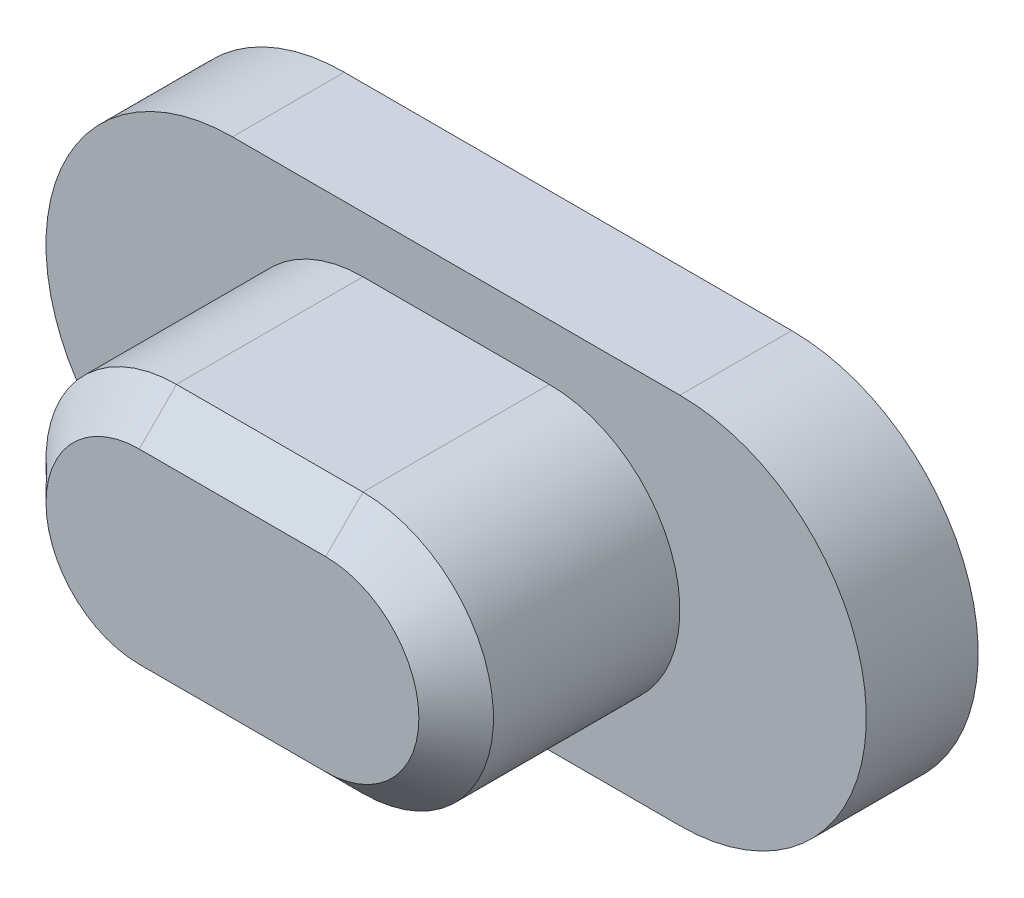
ISO-10303-21;
HEADER;
FILE_DESCRIPTION(('STEP AP214'),'2;1');
FILE_NAME('part.step','',(''),(''),'','','');
FILE_SCHEMA(('AUTOMOTIVE_DESIGN { 1 0 10303 214 1 1 1 1 }'));
ENDSEC;
DATA;
#1=APPLICATION_CONTEXT('core data for automotive mechanical design processes');
#2=APPLICATION_PROTOCOL_DEFINITION('international standard','automotive_design',2000,#1);
#3=PRODUCT_CONTEXT('',#1,'mechanical');
#4=PRODUCT('Part','Part','',(#3));
#5=PRODUCT_RELATED_PRODUCT_CATEGORY('part','',(#4));
#6=PRODUCT_DEFINITION_FORMATION('','',#4);
#7=PRODUCT_DEFINITION_CONTEXT('part definition',#1,'design');
#8=PRODUCT_DEFINITION('design','',#6,#7);
#9=PRODUCT_DEFINITION_SHAPE('','',#8);
#10=(LENGTH_UNIT() NAMED_UNIT(*) SI_UNIT(.MILLI.,.METRE.));
#11=(NAMED_UNIT(*) PLANE_ANGLE_UNIT() SI_UNIT($,.RADIAN.));
#12=(NAMED_UNIT(*) SI_UNIT($,.STERADIAN.) SOLID_ANGLE_UNIT());
#13=UNCERTAINTY_MEASURE_WITH_UNIT(LENGTH_MEASURE(1.E-05),#10,'distance_accuracy_value','');
#14=(GEOMETRIC_REPRESENTATION_CONTEXT(3) GLOBAL_UNCERTAINTY_ASSIGNED_CONTEXT((#13)) GLOBAL_UNIT_ASSIGNED_CONTEXT((#10,
#11,#12)) REPRESENTATION_CONTEXT('',''));
#15=CARTESIAN_POINT('',(0.,0.,0.));
#16=DIRECTION('',(0.,0.,1.));
#17=DIRECTION('',(1.,0.,0.));
#18=AXIS2_PLACEMENT_3D('',#15,#16,#17);
#19=CARTESIAN_POINT('',(-6.,0.,3.));
#20=DIRECTION('',(0.,0.,1.));
#21=DIRECTION('',(1.,0.,0.));
#22=AXIS2_PLACEMENT_3D('',#19,#20,#21);
#23=PLANE('',#22);
#24=CARTESIAN_POINT('',(-6.,0.,3.));
#25=DIRECTION('',(0.,0.,1.));
#26=DIRECTION('',(1.,0.,0.));
#27=AXIS2_PLACEMENT_3D('',#24,#25,#26);
#28=CIRCLE('',#27,5.);
#29=CARTESIAN_POINT('',(-6.,5.,3.));
#30=VERTEX_POINT('',#29);
#31=CARTESIAN_POINT('',(-6.,-5.,3.));
#32=VERTEX_POINT('',#31);
#33=EDGE_CURVE('E199',#30,#32,#28,.T.);
#34=ORIENTED_EDGE('',*,*,#33,.T.);
#35=DIRECTION('',(1.,0.,0.));
#36=VECTOR('',#35,1.);
#37=CARTESIAN_POINT('',(-6.,-5.,3.));
#38=LINE('',#37,#36);
#39=CARTESIAN_POINT('',(6.,-5.,3.));
#40=VERTEX_POINT('',#39);
#41=EDGE_CURVE('E202',#32,#40,#38,.T.);
#42=ORIENTED_EDGE('',*,*,#41,.T.);
#43=CARTESIAN_POINT('',(6.,0.,3.));
#44=DIRECTION('',(0.,0.,1.));
#45=DIRECTION('',(1.,0.,0.));
#46=AXIS2_PLACEMENT_3D('',#43,#44,#45);
#47=CIRCLE('',#46,5.);
#48=CARTESIAN_POINT('',(6.,5.00000000000001,3.));
#49=VERTEX_POINT('',#48);
#50=EDGE_CURVE('E205',#40,#49,#47,.T.);
#51=ORIENTED_EDGE('',*,*,#50,.T.);
#52=DIRECTION('',(-1.,0.,0.));
#53=VECTOR('',#52,1.);
#54=CARTESIAN_POINT('',(-6.,5.,3.));
#55=LINE('',#54,#53);
#56=EDGE_CURVE('E207',#49,#30,#55,.T.);
#57=ORIENTED_EDGE('',*,*,#56,.T.);
#58=EDGE_LOOP('',(#34,#42,#51,#57));
#59=FACE_BOUND('',#58,.T.);
#60=DIRECTION('',(1.,0.,0.));
#61=VECTOR('',#60,1.);
#62=CARTESIAN_POINT('',(-2.5,-3.5,3.));
#63=LINE('',#62,#61);
#64=CARTESIAN_POINT('',(-2.5,-3.5,3.));
#65=VERTEX_POINT('',#64);
#66=CARTESIAN_POINT('',(2.5,-3.5,3.));
#67=VERTEX_POINT('',#66);
#68=EDGE_CURVE('E181',#65,#67,#63,.T.);
#69=ORIENTED_EDGE('',*,*,#68,.F.);
#70=CARTESIAN_POINT('',(-2.5,0.,3.));
#71=DIRECTION('',(0.,0.,1.));
#72=DIRECTION('',(1.,0.,0.));
#73=AXIS2_PLACEMENT_3D('',#70,#71,#72);
#74=CIRCLE('',#73,3.5);
#75=CARTESIAN_POINT('',(-2.5,3.5,3.));
#76=VERTEX_POINT('',#75);
#77=EDGE_CURVE('E175',#76,#65,#74,.T.);
#78=ORIENTED_EDGE('',*,*,#77,.F.);
#79=DIRECTION('',(-1.,0.,0.));
#80=VECTOR('',#79,1.);
#81=CARTESIAN_POINT('',(-2.5,3.5,3.));
#82=LINE('',#81,#80);
#83=CARTESIAN_POINT('',(2.5,3.5,3.));
#84=VERTEX_POINT('',#83);
#85=EDGE_CURVE('E187',#84,#76,#82,.T.);
#86=ORIENTED_EDGE('',*,*,#85,.F.);
#87=CARTESIAN_POINT('',(2.5,0.,3.));
#88=DIRECTION('',(0.,0.,1.));
#89=DIRECTION('',(1.,0.,0.));
#90=AXIS2_PLACEMENT_3D('',#87,#88,#89);
#91=CIRCLE('',#90,3.5);
#92=EDGE_CURVE('E184',#67,#84,#91,.T.);
#93=ORIENTED_EDGE('',*,*,#92,.F.);
#94=EDGE_LOOP('',(#69,#78,#86,#93));
#95=FACE_BOUND('',#94,.T.);
#96=ADVANCED_FACE('F35',(#59,#95),#23,.T.);
#97=CARTESIAN_POINT('',(-6.,0.,3.));
#98=DIRECTION('',(0.,0.,-1.));
#99=DIRECTION('',(-1.,0.,0.));
#100=AXIS2_PLACEMENT_3D('',#97,#98,#99);
#101=CYLINDRICAL_SURFACE('',#100,5.);
#102=CARTESIAN_POINT('',(-6.,0.,0.));
#103=DIRECTION('',(0.,0.,1.));
#104=DIRECTION('',(1.,0.,0.));
#105=AXIS2_PLACEMENT_3D('',#102,#103,#104);
#106=CIRCLE('',#105,5.);
#107=CARTESIAN_POINT('',(-6.,5.,0.));
#108=VERTEX_POINT('',#107);
#109=CARTESIAN_POINT('',(-6.,-5.,0.));
#110=VERTEX_POINT('',#109);
#111=EDGE_CURVE('E198',#108,#110,#106,.T.);
#112=ORIENTED_EDGE('',*,*,#111,.T.);
#113=DIRECTION('',(0.,0.,-1.));
#114=VECTOR('',#113,1.);
#115=CARTESIAN_POINT('',(-6.,-5.,3.));
#116=LINE('',#115,#114);
#117=EDGE_CURVE('E225',#32,#110,#116,.T.);
#118=ORIENTED_EDGE('',*,*,#117,.F.);
#119=ORIENTED_EDGE('',*,*,#33,.F.);
#120=DIRECTION('',(0.,0.,-1.));
#121=VECTOR('',#120,1.);
#122=CARTESIAN_POINT('',(-6.,5.,3.));
#123=LINE('',#122,#121);
#124=EDGE_CURVE('E209',#30,#108,#123,.T.);
#125=ORIENTED_EDGE('',*,*,#124,.T.);
#126=EDGE_LOOP('',(#112,#118,#119,#125));
#127=FACE_BOUND('',#126,.T.);
#128=ADVANCED_FACE('F286',(#127),#101,.T.);
#129=CARTESIAN_POINT('',(-6.,-5.,3.));
#130=DIRECTION('',(0.,1.,0.));
#131=DIRECTION('',(-1.,0.,0.));
#132=AXIS2_PLACEMENT_3D('',#129,#130,#131);
#133=PLANE('',#132);
#134=DIRECTION('',(1.,0.,0.));
#135=VECTOR('',#134,1.);
#136=CARTESIAN_POINT('',(-6.,-5.,0.));
#137=LINE('',#136,#135);
#138=CARTESIAN_POINT('',(6.,-5.,0.));
#139=VERTEX_POINT('',#138);
#140=EDGE_CURVE('E212',#110,#139,#137,.T.);
#141=ORIENTED_EDGE('',*,*,#140,.T.);
#142=DIRECTION('',(0.,0.,-1.));
#143=VECTOR('',#142,1.);
#144=CARTESIAN_POINT('',(6.,-5.,3.));
#145=LINE('',#144,#143);
#146=EDGE_CURVE('E222',#40,#139,#145,.T.);
#147=ORIENTED_EDGE('',*,*,#146,.F.);
#148=ORIENTED_EDGE('',*,*,#41,.F.);
#149=ORIENTED_EDGE('',*,*,#117,.T.);
#150=EDGE_LOOP('',(#141,#147,#148,#149));
#151=FACE_BOUND('',#150,.T.);
#152=ADVANCED_FACE('F292',(#151),#133,.F.);
#153=CARTESIAN_POINT('',(6.,0.,3.));
#154=DIRECTION('',(0.,0.,-1.));
#155=DIRECTION('',(-1.,0.,0.));
#156=AXIS2_PLACEMENT_3D('',#153,#154,#155);
#157=CYLINDRICAL_SURFACE('',#156,5.);
#158=CARTESIAN_POINT('',(6.,0.,0.));
#159=DIRECTION('',(0.,0.,1.));
#160=DIRECTION('',(1.,0.,0.));
#161=AXIS2_PLACEMENT_3D('',#158,#159,#160);
#162=CIRCLE('',#161,5.);
#163=CARTESIAN_POINT('',(6.,5.00000000000001,0.));
#164=VERTEX_POINT('',#163);
#165=EDGE_CURVE('E214',#139,#164,#162,.T.);
#166=ORIENTED_EDGE('',*,*,#165,.T.);
#167=DIRECTION('',(0.,0.,-1.));
#168=VECTOR('',#167,1.);
#169=CARTESIAN_POINT('',(6.,5.00000000000001,3.));
#170=LINE('',#169,#168);
#171=EDGE_CURVE('E219',#49,#164,#170,.T.);
#172=ORIENTED_EDGE('',*,*,#171,.F.);
#173=ORIENTED_EDGE('',*,*,#50,.F.);
#174=ORIENTED_EDGE('',*,*,#146,.T.);
#175=EDGE_LOOP('',(#166,#172,#173,#174));
#176=FACE_BOUND('',#175,.T.);
#177=ADVANCED_FACE('F306',(#176),#157,.T.);
#178=CARTESIAN_POINT('',(-6.,5.,3.));
#179=DIRECTION('',(0.,-1.,0.));
#180=DIRECTION('',(1.,0.,0.));
#181=AXIS2_PLACEMENT_3D('',#178,#179,#180);
#182=PLANE('',#181);
#183=DIRECTION('',(-1.,0.,0.));
#184=VECTOR('',#183,1.);
#185=CARTESIAN_POINT('',(-6.,5.,0.));
#186=LINE('',#185,#184);
#187=EDGE_CURVE('E203',#164,#108,#186,.T.);
#188=ORIENTED_EDGE('',*,*,#187,.T.);
#189=ORIENTED_EDGE('',*,*,#124,.F.);
#190=ORIENTED_EDGE('',*,*,#56,.F.);
#191=ORIENTED_EDGE('',*,*,#171,.T.);
#192=EDGE_LOOP('',(#188,#189,#190,#191));
#193=FACE_BOUND('',#192,.T.);
#194=ADVANCED_FACE('F302',(#193),#182,.F.);
#195=CARTESIAN_POINT('',(-6.,0.,0.));
#196=DIRECTION('',(0.,0.,1.));
#197=DIRECTION('',(1.,0.,0.));
#198=AXIS2_PLACEMENT_3D('',#195,#196,#197);
#199=PLANE('',#198);
#200=DIRECTION('',(1.,0.,0.));
#201=VECTOR('',#200,1.);
#202=CARTESIAN_POINT('',(-0.75,2.,0.));
#203=LINE('',#202,#201);
#204=CARTESIAN_POINT('',(-0.75,2.,0.));
#205=VERTEX_POINT('',#204);
#206=CARTESIAN_POINT('',(0.750000000000001,2.,0.));
#207=VERTEX_POINT('',#206);
#208=EDGE_CURVE('E169',#205,#207,#203,.T.);
#209=ORIENTED_EDGE('',*,*,#208,.F.);
#210=CARTESIAN_POINT('',(-0.75,0.,0.));
#211=DIRECTION('',(0.,0.,-1.));
#212=DIRECTION('',(-1.,0.,0.));
#213=AXIS2_PLACEMENT_3D('',#210,#211,#212);
#214=CIRCLE('',#213,2.);
#215=CARTESIAN_POINT('',(-0.750000000000001,-2.,0.));
#216=VERTEX_POINT('',#215);
#217=EDGE_CURVE('E143',#216,#205,#214,.T.);
#218=ORIENTED_EDGE('',*,*,#217,.F.);
#219=DIRECTION('',(-1.,0.,0.));
#220=VECTOR('',#219,1.);
#221=CARTESIAN_POINT('',(-0.750000000000001,-2.,0.));
#222=LINE('',#221,#220);
#223=CARTESIAN_POINT('',(0.75,-2.,0.));
#224=VERTEX_POINT('',#223);
#225=EDGE_CURVE('E160',#224,#216,#222,.T.);
#226=ORIENTED_EDGE('',*,*,#225,.F.);
#227=CARTESIAN_POINT('',(0.75,0.,0.));
#228=DIRECTION('',(0.,0.,-1.));
#229=DIRECTION('',(-1.,0.,0.));
#230=AXIS2_PLACEMENT_3D('',#227,#228,#229);
#231=CIRCLE('',#230,2.);
#232=EDGE_CURVE('E163',#207,#224,#231,.T.);
#233=ORIENTED_EDGE('',*,*,#232,.F.);
#234=EDGE_LOOP('',(#209,#218,#226,#233));
#235=FACE_BOUND('',#234,.T.);
#236=ORIENTED_EDGE('',*,*,#111,.F.);
#237=ORIENTED_EDGE('',*,*,#187,.F.);
#238=ORIENTED_EDGE('',*,*,#165,.F.);
#239=ORIENTED_EDGE('',*,*,#140,.F.);
#240=EDGE_LOOP('',(#236,#237,#238,#239));
#241=FACE_BOUND('',#240,.T.);
#242=ADVANCED_FACE('F299',(#235,#241),#199,.F.);
#243=CARTESIAN_POINT('',(-2.5,0.,9.));
#244=DIRECTION('',(0.,0.,-1.));
#245=DIRECTION('',(-1.,0.,0.));
#246=AXIS2_PLACEMENT_3D('',#243,#244,#245);
#247=CYLINDRICAL_SURFACE('',#246,3.5);
#248=DIRECTION('',(0.,0.,-1.));
#249=VECTOR('',#248,1.);
#250=CARTESIAN_POINT('',(-2.5,-3.5,9.));
#251=LINE('',#250,#249);
#252=CARTESIAN_POINT('',(-2.5,-3.5,8.));
#253=VERTEX_POINT('',#252);
#254=EDGE_CURVE('E196',#253,#65,#251,.T.);
#255=ORIENTED_EDGE('',*,*,#254,.F.);
#256=CARTESIAN_POINT('',(-2.5,0.,8.));
#257=DIRECTION('',(0.,0.,1.));
#258=DIRECTION('',(1.,0.,0.));
#259=AXIS2_PLACEMENT_3D('',#256,#257,#258);
#260=CIRCLE('',#259,3.5);
#261=CARTESIAN_POINT('',(-2.5,3.5,8.));
#262=VERTEX_POINT('',#261);
#263=EDGE_CURVE('E240',#253,#262,#260,.F.);
#264=ORIENTED_EDGE('',*,*,#263,.T.);
#265=DIRECTION('',(0.,0.,-1.));
#266=VECTOR('',#265,1.);
#267=CARTESIAN_POINT('',(-2.5,3.5,9.));
#268=LINE('',#267,#266);
#269=EDGE_CURVE('E190',#262,#76,#268,.T.);
#270=ORIENTED_EDGE('',*,*,#269,.T.);
#271=ORIENTED_EDGE('',*,*,#77,.T.);
#272=EDGE_LOOP('',(#255,#264,#270,#271));
#273=FACE_BOUND('',#272,.T.);
#274=ADVANCED_FACE('F264',(#273),#247,.T.);
#275=CARTESIAN_POINT('',(-2.5,-3.5,9.));
#276=DIRECTION('',(0.,1.,0.));
#277=DIRECTION('',(-1.,0.,0.));
#278=AXIS2_PLACEMENT_3D('',#275,#276,#277);
#279=PLANE('',#278);
#280=DIRECTION('',(0.,0.,-1.));
#281=VECTOR('',#280,1.);
#282=CARTESIAN_POINT('',(2.5,-3.5,9.));
#283=LINE('',#282,#281);
#284=CARTESIAN_POINT('',(2.5,-3.5,8.));
#285=VERTEX_POINT('',#284);
#286=EDGE_CURVE('E194',#285,#67,#283,.T.);
#287=ORIENTED_EDGE('',*,*,#286,.F.);
#288=DIRECTION('',(-1.,0.,0.));
#289=VECTOR('',#288,1.);
#290=CARTESIAN_POINT('',(-2.5,-3.5,8.));
#291=LINE('',#290,#289);
#292=EDGE_CURVE('E11',#285,#253,#291,.T.);
#293=ORIENTED_EDGE('',*,*,#292,.T.);
#294=ORIENTED_EDGE('',*,*,#254,.T.);
#295=ORIENTED_EDGE('',*,*,#68,.T.);
#296=EDGE_LOOP('',(#287,#293,#294,#295));
#297=FACE_BOUND('',#296,.T.);
#298=ADVANCED_FACE('F371',(#297),#279,.F.);
#299=CARTESIAN_POINT('',(2.5,0.,9.));
#300=DIRECTION('',(0.,0.,-1.));
#301=DIRECTION('',(-1.,0.,0.));
#302=AXIS2_PLACEMENT_3D('',#299,#300,#301);
#303=CYLINDRICAL_SURFACE('',#302,3.5);
#304=DIRECTION('',(0.,0.,-1.));
#305=VECTOR('',#304,1.);
#306=CARTESIAN_POINT('',(2.5,3.5,9.));
#307=LINE('',#306,#305);
#308=CARTESIAN_POINT('',(2.5,3.5,8.));
#309=VERTEX_POINT('',#308);
#310=EDGE_CURVE('E192',#309,#84,#307,.T.);
#311=ORIENTED_EDGE('',*,*,#310,.F.);
#312=CARTESIAN_POINT('',(2.5,0.,8.));
#313=DIRECTION('',(0.,0.,1.));
#314=DIRECTION('',(1.,0.,0.));
#315=AXIS2_PLACEMENT_3D('',#312,#313,#314);
#316=CIRCLE('',#315,3.5);
#317=EDGE_CURVE('E44',#309,#285,#316,.F.);
#318=ORIENTED_EDGE('',*,*,#317,.T.);
#319=ORIENTED_EDGE('',*,*,#286,.T.);
#320=ORIENTED_EDGE('',*,*,#92,.T.);
#321=EDGE_LOOP('',(#311,#318,#319,#320));
#322=FACE_BOUND('',#321,.T.);
#323=ADVANCED_FACE('F283',(#322),#303,.T.);
#324=CARTESIAN_POINT('',(-2.5,3.5,9.));
#325=DIRECTION('',(0.,-1.,0.));
#326=DIRECTION('',(1.,0.,0.));
#327=AXIS2_PLACEMENT_3D('',#324,#325,#326);
#328=PLANE('',#327);
#329=ORIENTED_EDGE('',*,*,#269,.F.);
#330=DIRECTION('',(1.,0.,0.));
#331=VECTOR('',#330,1.);
#332=CARTESIAN_POINT('',(2.5,3.5,8.));
#333=LINE('',#332,#331);
#334=EDGE_CURVE('E237',#262,#309,#333,.T.);
#335=ORIENTED_EDGE('',*,*,#334,.T.);
#336=ORIENTED_EDGE('',*,*,#310,.T.);
#337=ORIENTED_EDGE('',*,*,#85,.T.);
#338=EDGE_LOOP('',(#329,#335,#336,#337));
#339=FACE_BOUND('',#338,.T.);
#340=ADVANCED_FACE('F267',(#339),#328,.F.);
#341=CARTESIAN_POINT('',(-2.5,0.,9.));
#342=DIRECTION('',(0.,0.,1.));
#343=DIRECTION('',(1.,0.,0.));
#344=AXIS2_PLACEMENT_3D('',#341,#342,#343);
#345=PLANE('',#344);
#346=CARTESIAN_POINT('',(2.5,0.,9.));
#347=DIRECTION('',(0.,0.,1.));
#348=DIRECTION('',(1.,0.,0.));
#349=AXIS2_PLACEMENT_3D('',#346,#347,#348);
#350=CIRCLE('',#349,2.5);
#351=CARTESIAN_POINT('',(2.5,-2.5,9.));
#352=VERTEX_POINT('',#351);
#353=CARTESIAN_POINT('',(2.5,2.5,9.));
#354=VERTEX_POINT('',#353);
#355=EDGE_CURVE('E230',#352,#354,#350,.T.);
#356=ORIENTED_EDGE('',*,*,#355,.T.);
#357=DIRECTION('',(-1.,0.,0.));
#358=VECTOR('',#357,1.);
#359=CARTESIAN_POINT('',(-2.5,2.5,9.));
#360=LINE('',#359,#358);
#361=CARTESIAN_POINT('',(-2.5,2.5,9.));
#362=VERTEX_POINT('',#361);
#363=EDGE_CURVE('E234',#354,#362,#360,.T.);
#364=ORIENTED_EDGE('',*,*,#363,.T.);
#365=CARTESIAN_POINT('',(-2.5,0.,9.));
#366=DIRECTION('',(0.,0.,1.));
#367=DIRECTION('',(1.,0.,0.));
#368=AXIS2_PLACEMENT_3D('',#365,#366,#367);
#369=CIRCLE('',#368,2.5);
#370=CARTESIAN_POINT('',(-2.5,-2.5,9.));
#371=VERTEX_POINT('',#370);
#372=EDGE_CURVE('E232',#362,#371,#369,.T.);
#373=ORIENTED_EDGE('',*,*,#372,.T.);
#374=DIRECTION('',(1.,0.,0.));
#375=VECTOR('',#374,1.);
#376=CARTESIAN_POINT('',(2.5,-2.5,9.));
#377=LINE('',#376,#375);
#378=EDGE_CURVE('E228',#371,#352,#377,.T.);
#379=ORIENTED_EDGE('',*,*,#378,.T.);
#380=EDGE_LOOP('',(#356,#364,#373,#379));
#381=FACE_BOUND('',#380,.T.);
#382=ADVANCED_FACE('F274',(#381),#345,.T.);
#383=CARTESIAN_POINT('',(-0.75,0.,4.));
#384=DIRECTION('',(0.,0.,-1.));
#385=DIRECTION('',(-1.,0.,0.));
#386=AXIS2_PLACEMENT_3D('',#383,#384,#385);
#387=CYLINDRICAL_SURFACE('',#386,2.);
#388=ORIENTED_EDGE('',*,*,#217,.T.);
#389=DIRECTION('',(0.,0.,-1.));
#390=VECTOR('',#389,1.);
#391=CARTESIAN_POINT('',(-0.75,2.,4.));
#392=LINE('',#391,#390);
#393=CARTESIAN_POINT('',(-0.75,2.,4.));
#394=VERTEX_POINT('',#393);
#395=EDGE_CURVE('E136',#394,#205,#392,.T.);
#396=ORIENTED_EDGE('',*,*,#395,.F.);
#397=CARTESIAN_POINT('',(-0.75,0.,4.));
#398=DIRECTION('',(0.,0.,-1.));
#399=DIRECTION('',(-1.,0.,0.));
#400=AXIS2_PLACEMENT_3D('',#397,#398,#399);
#401=CIRCLE('',#400,2.);
#402=CARTESIAN_POINT('',(-0.750000000000001,-2.,4.));
#403=VERTEX_POINT('',#402);
#404=EDGE_CURVE('E140',#403,#394,#401,.T.);
#405=ORIENTED_EDGE('',*,*,#404,.F.);
#406=DIRECTION('',(0.,0.,-1.));
#407=VECTOR('',#406,1.);
#408=CARTESIAN_POINT('',(-0.750000000000001,-2.,4.));
#409=LINE('',#408,#407);
#410=EDGE_CURVE('E173',#403,#216,#409,.T.);
#411=ORIENTED_EDGE('',*,*,#410,.T.);
#412=EDGE_LOOP('',(#388,#396,#405,#411));
#413=FACE_BOUND('',#412,.T.);
#414=ADVANCED_FACE('F138',(#413),#387,.F.);
#415=CARTESIAN_POINT('',(-0.750000000000001,-2.,4.));
#416=DIRECTION('',(0.,-1.,0.));
#417=DIRECTION('',(1.,0.,0.));
#418=AXIS2_PLACEMENT_3D('',#415,#416,#417);
#419=PLANE('',#418);
#420=ORIENTED_EDGE('',*,*,#225,.T.);
#421=ORIENTED_EDGE('',*,*,#410,.F.);
#422=DIRECTION('',(-1.,0.,0.));
#423=VECTOR('',#422,1.);
#424=CARTESIAN_POINT('',(-0.750000000000001,-2.,4.));
#425=LINE('',#424,#423);
#426=CARTESIAN_POINT('',(0.75,-2.,4.));
#427=VERTEX_POINT('',#426);
#428=EDGE_CURVE('E148',#427,#403,#425,.T.);
#429=ORIENTED_EDGE('',*,*,#428,.F.);
#430=DIRECTION('',(0.,0.,-1.));
#431=VECTOR('',#430,1.);
#432=CARTESIAN_POINT('',(0.75,-2.,4.));
#433=LINE('',#432,#431);
#434=EDGE_CURVE('E176',#427,#224,#433,.T.);
#435=ORIENTED_EDGE('',*,*,#434,.T.);
#436=EDGE_LOOP('',(#420,#421,#429,#435));
#437=FACE_BOUND('',#436,.T.);
#438=ADVANCED_FACE('F281',(#437),#419,.F.);
#439=CARTESIAN_POINT('',(0.75,0.,4.));
#440=DIRECTION('',(0.,0.,-1.));
#441=DIRECTION('',(-1.,0.,0.));
#442=AXIS2_PLACEMENT_3D('',#439,#440,#441);
#443=CYLINDRICAL_SURFACE('',#442,2.);
#444=ORIENTED_EDGE('',*,*,#232,.T.);
#445=ORIENTED_EDGE('',*,*,#434,.F.);
#446=CARTESIAN_POINT('',(0.75,0.,4.));
#447=DIRECTION('',(0.,0.,-1.));
#448=DIRECTION('',(-1.,0.,0.));
#449=AXIS2_PLACEMENT_3D('',#446,#447,#448);
#450=CIRCLE('',#449,2.);
#451=CARTESIAN_POINT('',(0.750000000000001,2.,4.));
#452=VERTEX_POINT('',#451);
#453=EDGE_CURVE('E156',#452,#427,#450,.T.);
#454=ORIENTED_EDGE('',*,*,#453,.F.);
#455=DIRECTION('',(0.,0.,-1.));
#456=VECTOR('',#455,1.);
#457=CARTESIAN_POINT('',(0.750000000000001,2.,4.));
#458=LINE('',#457,#456);
#459=EDGE_CURVE('E147',#452,#207,#458,.T.);
#460=ORIENTED_EDGE('',*,*,#459,.T.);
#461=EDGE_LOOP('',(#444,#445,#454,#460));
#462=FACE_BOUND('',#461,.T.);
#463=ADVANCED_FACE('F328',(#462),#443,.F.);
#464=CARTESIAN_POINT('',(-0.75,2.,4.));
#465=DIRECTION('',(0.,1.,0.));
#466=DIRECTION('',(-1.,0.,0.));
#467=AXIS2_PLACEMENT_3D('',#464,#465,#466);
#468=PLANE('',#467);
#469=ORIENTED_EDGE('',*,*,#208,.T.);
#470=ORIENTED_EDGE('',*,*,#459,.F.);
#471=DIRECTION('',(1.,0.,0.));
#472=VECTOR('',#471,1.);
#473=CARTESIAN_POINT('',(-0.75,2.,4.));
#474=LINE('',#473,#472);
#475=EDGE_CURVE('E151',#394,#452,#474,.T.);
#476=ORIENTED_EDGE('',*,*,#475,.F.);
#477=ORIENTED_EDGE('',*,*,#395,.T.);
#478=EDGE_LOOP('',(#469,#470,#476,#477));
#479=FACE_BOUND('',#478,.T.);
#480=ADVANCED_FACE('F152',(#479),#468,.F.);
#481=CARTESIAN_POINT('',(-0.75,0.,4.));
#482=DIRECTION('',(0.,0.,-1.));
#483=DIRECTION('',(-1.,0.,0.));
#484=AXIS2_PLACEMENT_3D('',#481,#482,#483);
#485=PLANE('',#484);
#486=ORIENTED_EDGE('',*,*,#404,.T.);
#487=ORIENTED_EDGE('',*,*,#475,.T.);
#488=ORIENTED_EDGE('',*,*,#453,.T.);
#489=ORIENTED_EDGE('',*,*,#428,.T.);
#490=EDGE_LOOP('',(#486,#487,#488,#489));
#491=FACE_BOUND('',#490,.T.);
#492=ADVANCED_FACE('F158',(#491),#485,.T.);
#493=CARTESIAN_POINT('',(-2.5,-2.5,9.));
#494=DIRECTION('',(0.,-0.707106781186549,0.707106781186546));
#495=DIRECTION('',(-1.,0.,0.));
#496=AXIS2_PLACEMENT_3D('',#493,#494,#495);
#497=PLANE('',#496);
#498=DIRECTION('',(0.,0.707106781186546,0.707106781186549));
#499=VECTOR('',#498,1.);
#500=CARTESIAN_POINT('',(-2.5,-3.5,8.));
#501=LINE('',#500,#499);
#502=EDGE_CURVE('E246',#253,#371,#501,.T.);
#503=ORIENTED_EDGE('',*,*,#502,.F.);
#504=ORIENTED_EDGE('',*,*,#292,.F.);
#505=DIRECTION('',(0.,-0.707106781186546,-0.707106781186549));
#506=VECTOR('',#505,1.);
#507=CARTESIAN_POINT('',(2.5,-2.5,9.));
#508=LINE('',#507,#506);
#509=EDGE_CURVE('E39',#352,#285,#508,.T.);
#510=ORIENTED_EDGE('',*,*,#509,.F.);
#511=ORIENTED_EDGE('',*,*,#378,.F.);
#512=EDGE_LOOP('',(#503,#504,#510,#511));
#513=FACE_BOUND('',#512,.T.);
#514=ADVANCED_FACE('F37',(#513),#497,.T.);
#515=CARTESIAN_POINT('',(2.5,0.,9.));
#516=DIRECTION('',(0.,0.,-1.));
#517=DIRECTION('',(-1.,0.,0.));
#518=AXIS2_PLACEMENT_3D('',#515,#516,#517);
#519=CONICAL_SURFACE('',#518,2.5,0.785398163397447);
#520=ORIENTED_EDGE('',*,*,#509,.T.);
#521=ORIENTED_EDGE('',*,*,#317,.F.);
#522=DIRECTION('',(0.,0.707106781186546,-0.707106781186549));
#523=VECTOR('',#522,1.);
#524=CARTESIAN_POINT('',(2.5,2.5,9.));
#525=LINE('',#524,#523);
#526=EDGE_CURVE('E245',#354,#309,#525,.T.);
#527=ORIENTED_EDGE('',*,*,#526,.F.);
#528=ORIENTED_EDGE('',*,*,#355,.F.);
#529=EDGE_LOOP('',(#520,#521,#527,#528));
#530=FACE_BOUND('',#529,.T.);
#531=ADVANCED_FACE('F256',(#530),#519,.T.);
#532=CARTESIAN_POINT('',(-2.5,0.,9.));
#533=DIRECTION('',(0.,0.,-1.));
#534=DIRECTION('',(-1.,0.,0.));
#535=AXIS2_PLACEMENT_3D('',#532,#533,#534);
#536=CONICAL_SURFACE('',#535,2.5,0.785398163397447);
#537=ORIENTED_EDGE('',*,*,#502,.T.);
#538=ORIENTED_EDGE('',*,*,#372,.F.);
#539=DIRECTION('',(0.,-0.707106781186546,0.707106781186549));
#540=VECTOR('',#539,1.);
#541=CARTESIAN_POINT('',(-2.5,3.5,8.));
#542=LINE('',#541,#540);
#543=EDGE_CURVE('E243',#262,#362,#542,.T.);
#544=ORIENTED_EDGE('',*,*,#543,.F.);
#545=ORIENTED_EDGE('',*,*,#263,.F.);
#546=EDGE_LOOP('',(#537,#538,#544,#545));
#547=FACE_BOUND('',#546,.T.);
#548=ADVANCED_FACE('F261',(#547),#536,.T.);
#549=CARTESIAN_POINT('',(-2.5,2.5,9.));
#550=DIRECTION('',(0.,0.707106781186549,0.707106781186546));
#551=DIRECTION('',(1.,0.,0.));
#552=AXIS2_PLACEMENT_3D('',#549,#550,#551);
#553=PLANE('',#552);
#554=ORIENTED_EDGE('',*,*,#526,.T.);
#555=ORIENTED_EDGE('',*,*,#334,.F.);
#556=ORIENTED_EDGE('',*,*,#543,.T.);
#557=ORIENTED_EDGE('',*,*,#363,.F.);
#558=EDGE_LOOP('',(#554,#555,#556,#557));
#559=FACE_BOUND('',#558,.T.);
#560=ADVANCED_FACE('F271',(#559),#553,.T.);
#561=CLOSED_SHELL('',(#96,#128,#152,#177,#194,#242,#274,#298,#323,#340,#382,#414,#438,#463,#480,
#492,#514,#531,#548,#560));
#562=MANIFOLD_SOLID_BREP('B2',#561);
#563=ADVANCED_BREP_SHAPE_REPRESENTATION('',(#18,#562),#14);
#564=SHAPE_DEFINITION_REPRESENTATION(#9,#563);
ENDSEC;
END-ISO-10303-21;
